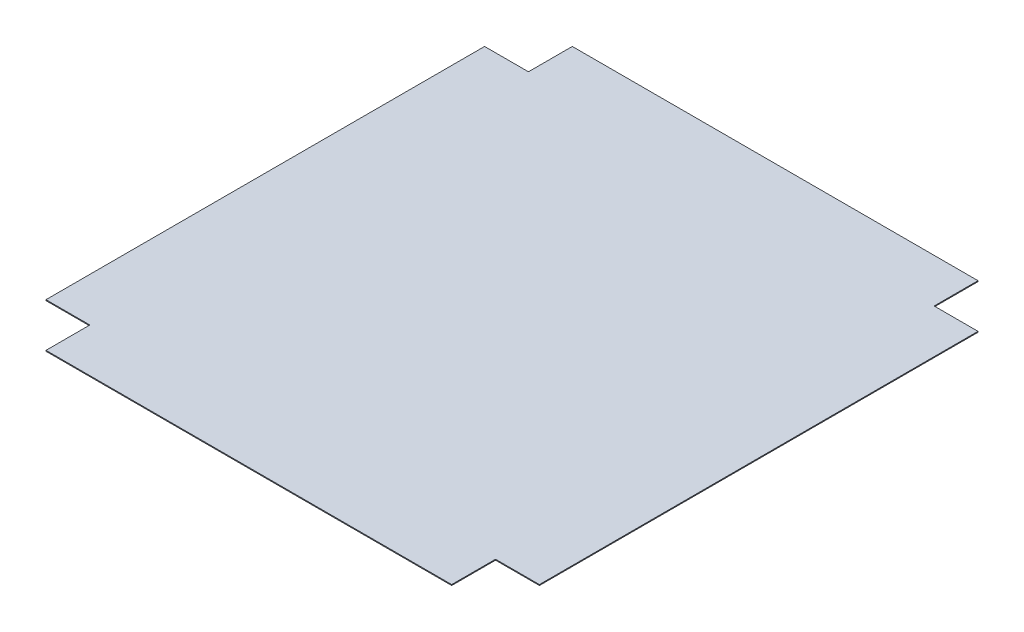
ISO-10303-21;
HEADER;
FILE_DESCRIPTION(('STEP AP214'),'2;1');
FILE_NAME('part.step','',(''),(''),'','','');
FILE_SCHEMA(('AUTOMOTIVE_DESIGN { 1 0 10303 214 1 1 1 1 }'));
ENDSEC;
DATA;
#1=APPLICATION_CONTEXT('core data for automotive mechanical design processes');
#2=APPLICATION_PROTOCOL_DEFINITION('international standard','automotive_design',2000,#1);
#3=PRODUCT_CONTEXT('',#1,'mechanical');
#4=PRODUCT('Part','Part','',(#3));
#5=PRODUCT_RELATED_PRODUCT_CATEGORY('part','',(#4));
#6=PRODUCT_DEFINITION_FORMATION('','',#4);
#7=PRODUCT_DEFINITION_CONTEXT('part definition',#1,'design');
#8=PRODUCT_DEFINITION('design','',#6,#7);
#9=PRODUCT_DEFINITION_SHAPE('','',#8);
#10=(LENGTH_UNIT() NAMED_UNIT(*) SI_UNIT(.MILLI.,.METRE.));
#11=(NAMED_UNIT(*) PLANE_ANGLE_UNIT() SI_UNIT($,.RADIAN.));
#12=(NAMED_UNIT(*) SI_UNIT($,.STERADIAN.) SOLID_ANGLE_UNIT());
#13=UNCERTAINTY_MEASURE_WITH_UNIT(LENGTH_MEASURE(1.E-05),#10,'distance_accuracy_value','');
#14=(GEOMETRIC_REPRESENTATION_CONTEXT(3) GLOBAL_UNCERTAINTY_ASSIGNED_CONTEXT((#13)) GLOBAL_UNIT_ASSIGNED_CONTEXT((#10,
#11,#12)) REPRESENTATION_CONTEXT('',''));
#15=CARTESIAN_POINT('',(0.,0.,0.));
#16=DIRECTION('',(0.,0.,1.));
#17=DIRECTION('',(1.,0.,0.));
#18=AXIS2_PLACEMENT_3D('',#15,#16,#17);
#19=CARTESIAN_POINT('',(-92.5,0.4064,-120.));
#20=DIRECTION('',(0.,0.,1.));
#21=DIRECTION('',(1.,0.,0.));
#22=AXIS2_PLACEMENT_3D('',#19,#20,#21);
#23=PLANE('',#22);
#24=DIRECTION('',(-1.,0.,0.));
#25=VECTOR('',#24,1.);
#26=CARTESIAN_POINT('',(-92.5,0.,-120.));
#27=LINE('',#26,#25);
#28=CARTESIAN_POINT('',(92.5,0.,-120.));
#29=VERTEX_POINT('',#28);
#30=CARTESIAN_POINT('',(-92.5,0.,-120.));
#31=VERTEX_POINT('',#30);
#32=EDGE_CURVE('E159',#29,#31,#27,.T.);
#33=ORIENTED_EDGE('',*,*,#32,.T.);
#34=DIRECTION('',(0.,-1.,0.));
#35=VECTOR('',#34,1.);
#36=CARTESIAN_POINT('',(-92.5,0.4064,-120.));
#37=LINE('',#36,#35);
#38=CARTESIAN_POINT('',(-92.5,0.4064,-120.));
#39=VERTEX_POINT('',#38);
#40=EDGE_CURVE('E11',#39,#31,#37,.T.);
#41=ORIENTED_EDGE('',*,*,#40,.F.);
#42=DIRECTION('',(-1.,0.,0.));
#43=VECTOR('',#42,1.);
#44=CARTESIAN_POINT('',(-92.5,0.4064,-120.));
#45=LINE('',#44,#43);
#46=CARTESIAN_POINT('',(92.5,0.4064,-120.));
#47=VERTEX_POINT('',#46);
#48=EDGE_CURVE('E181',#47,#39,#45,.T.);
#49=ORIENTED_EDGE('',*,*,#48,.F.);
#50=DIRECTION('',(0.,-1.,0.));
#51=VECTOR('',#50,1.);
#52=CARTESIAN_POINT('',(92.5,0.4064,-120.));
#53=LINE('',#52,#51);
#54=EDGE_CURVE('E155',#47,#29,#53,.T.);
#55=ORIENTED_EDGE('',*,*,#54,.T.);
#56=EDGE_LOOP('',(#33,#41,#49,#55));
#57=FACE_BOUND('',#56,.T.);
#58=ADVANCED_FACE('F39',(#57),#23,.F.);
#59=CARTESIAN_POINT('',(-92.5,0.4064,-120.));
#60=DIRECTION('',(1.,0.,0.));
#61=DIRECTION('',(0.,0.,-1.));
#62=AXIS2_PLACEMENT_3D('',#59,#60,#61);
#63=PLANE('',#62);
#64=DIRECTION('',(0.,0.,1.));
#65=VECTOR('',#64,1.);
#66=CARTESIAN_POINT('',(-92.5,0.,-120.));
#67=LINE('',#66,#65);
#68=CARTESIAN_POINT('',(-92.5,0.,-100.000000122));
#69=VERTEX_POINT('',#68);
#70=EDGE_CURVE('E162',#31,#69,#67,.T.);
#71=ORIENTED_EDGE('',*,*,#70,.T.);
#72=DIRECTION('',(0.,-1.,0.));
#73=VECTOR('',#72,1.);
#74=CARTESIAN_POINT('',(-92.5,0.4064,-100.000000122));
#75=LINE('',#74,#73);
#76=CARTESIAN_POINT('',(-92.5,0.4064,-100.000000122));
#77=VERTEX_POINT('',#76);
#78=EDGE_CURVE('E47',#77,#69,#75,.T.);
#79=ORIENTED_EDGE('',*,*,#78,.F.);
#80=DIRECTION('',(0.,0.,1.));
#81=VECTOR('',#80,1.);
#82=CARTESIAN_POINT('',(-92.5,0.4064,-120.));
#83=LINE('',#82,#81);
#84=EDGE_CURVE('E110',#39,#77,#83,.T.);
#85=ORIENTED_EDGE('',*,*,#84,.F.);
#86=ORIENTED_EDGE('',*,*,#40,.T.);
#87=EDGE_LOOP('',(#71,#79,#85,#86));
#88=FACE_BOUND('',#87,.T.);
#89=ADVANCED_FACE('F259',(#88),#63,.F.);
#90=CARTESIAN_POINT('',(-92.5,0.4064,-100.000000122));
#91=DIRECTION('',(0.,0.,1.));
#92=DIRECTION('',(1.,0.,0.));
#93=AXIS2_PLACEMENT_3D('',#90,#91,#92);
#94=PLANE('',#93);
#95=DIRECTION('',(-1.,0.,0.));
#96=VECTOR('',#95,1.);
#97=CARTESIAN_POINT('',(-92.5,0.,-100.000000122));
#98=LINE('',#97,#96);
#99=CARTESIAN_POINT('',(-112.5,0.,-100.000000122));
#100=VERTEX_POINT('',#99);
#101=EDGE_CURVE('E164',#69,#100,#98,.T.);
#102=ORIENTED_EDGE('',*,*,#101,.T.);
#103=DIRECTION('',(0.,-1.,0.));
#104=VECTOR('',#103,1.);
#105=CARTESIAN_POINT('',(-112.5,0.4064,-100.000000122));
#106=LINE('',#105,#104);
#107=CARTESIAN_POINT('',(-112.5,0.4064,-100.000000122));
#108=VERTEX_POINT('',#107);
#109=EDGE_CURVE('E200',#108,#100,#106,.T.);
#110=ORIENTED_EDGE('',*,*,#109,.F.);
#111=DIRECTION('',(-1.,0.,0.));
#112=VECTOR('',#111,1.);
#113=CARTESIAN_POINT('',(-92.5,0.4064,-100.000000122));
#114=LINE('',#113,#112);
#115=EDGE_CURVE('E208',#77,#108,#114,.T.);
#116=ORIENTED_EDGE('',*,*,#115,.F.);
#117=ORIENTED_EDGE('',*,*,#78,.T.);
#118=EDGE_LOOP('',(#102,#110,#116,#117));
#119=FACE_BOUND('',#118,.T.);
#120=ADVANCED_FACE('F206',(#119),#94,.F.);
#121=CARTESIAN_POINT('',(-112.5,0.4064,100.000000122));
#122=DIRECTION('',(1.,0.,0.));
#123=DIRECTION('',(0.,0.,-1.));
#124=AXIS2_PLACEMENT_3D('',#121,#122,#123);
#125=PLANE('',#124);
#126=DIRECTION('',(0.,0.,1.));
#127=VECTOR('',#126,1.);
#128=CARTESIAN_POINT('',(-112.5,0.,100.000000122));
#129=LINE('',#128,#127);
#130=CARTESIAN_POINT('',(-112.5,0.,100.000000122));
#131=VERTEX_POINT('',#130);
#132=EDGE_CURVE('E166',#100,#131,#129,.T.);
#133=ORIENTED_EDGE('',*,*,#132,.T.);
#134=DIRECTION('',(0.,-1.,0.));
#135=VECTOR('',#134,1.);
#136=CARTESIAN_POINT('',(-112.5,0.4064,100.000000122));
#137=LINE('',#136,#135);
#138=CARTESIAN_POINT('',(-112.5,0.4064,100.000000122));
#139=VERTEX_POINT('',#138);
#140=EDGE_CURVE('E197',#139,#131,#137,.T.);
#141=ORIENTED_EDGE('',*,*,#140,.F.);
#142=DIRECTION('',(0.,0.,1.));
#143=VECTOR('',#142,1.);
#144=CARTESIAN_POINT('',(-112.5,0.4064,100.000000122));
#145=LINE('',#144,#143);
#146=EDGE_CURVE('E226',#108,#139,#145,.T.);
#147=ORIENTED_EDGE('',*,*,#146,.F.);
#148=ORIENTED_EDGE('',*,*,#109,.T.);
#149=EDGE_LOOP('',(#133,#141,#147,#148));
#150=FACE_BOUND('',#149,.T.);
#151=ADVANCED_FACE('F217',(#150),#125,.F.);
#152=CARTESIAN_POINT('',(-92.5,0.4064,100.000000122));
#153=DIRECTION('',(0.,0.,-1.));
#154=DIRECTION('',(-1.,0.,0.));
#155=AXIS2_PLACEMENT_3D('',#152,#153,#154);
#156=PLANE('',#155);
#157=DIRECTION('',(1.,0.,0.));
#158=VECTOR('',#157,1.);
#159=CARTESIAN_POINT('',(-92.5,0.,100.000000122));
#160=LINE('',#159,#158);
#161=CARTESIAN_POINT('',(-92.5,0.,100.000000122));
#162=VERTEX_POINT('',#161);
#163=EDGE_CURVE('E168',#131,#162,#160,.T.);
#164=ORIENTED_EDGE('',*,*,#163,.T.);
#165=DIRECTION('',(0.,-1.,0.));
#166=VECTOR('',#165,1.);
#167=CARTESIAN_POINT('',(-92.5,0.4064,100.000000122));
#168=LINE('',#167,#166);
#169=CARTESIAN_POINT('',(-92.5,0.4064,100.000000122));
#170=VERTEX_POINT('',#169);
#171=EDGE_CURVE('E194',#170,#162,#168,.T.);
#172=ORIENTED_EDGE('',*,*,#171,.F.);
#173=DIRECTION('',(1.,0.,0.));
#174=VECTOR('',#173,1.);
#175=CARTESIAN_POINT('',(-92.5,0.4064,100.000000122));
#176=LINE('',#175,#174);
#177=EDGE_CURVE('E223',#139,#170,#176,.T.);
#178=ORIENTED_EDGE('',*,*,#177,.F.);
#179=ORIENTED_EDGE('',*,*,#140,.T.);
#180=EDGE_LOOP('',(#164,#172,#178,#179));
#181=FACE_BOUND('',#180,.T.);
#182=ADVANCED_FACE('F221',(#181),#156,.F.);
#183=CARTESIAN_POINT('',(-92.5,0.4064,120.));
#184=DIRECTION('',(1.,0.,0.));
#185=DIRECTION('',(0.,0.,-1.));
#186=AXIS2_PLACEMENT_3D('',#183,#184,#185);
#187=PLANE('',#186);
#188=DIRECTION('',(0.,0.,1.));
#189=VECTOR('',#188,1.);
#190=CARTESIAN_POINT('',(-92.5,0.,120.));
#191=LINE('',#190,#189);
#192=CARTESIAN_POINT('',(-92.5,0.,120.));
#193=VERTEX_POINT('',#192);
#194=EDGE_CURVE('E170',#162,#193,#191,.T.);
#195=ORIENTED_EDGE('',*,*,#194,.T.);
#196=DIRECTION('',(0.,-1.,0.));
#197=VECTOR('',#196,1.);
#198=CARTESIAN_POINT('',(-92.5,0.4064,120.));
#199=LINE('',#198,#197);
#200=CARTESIAN_POINT('',(-92.5,0.4064,120.));
#201=VERTEX_POINT('',#200);
#202=EDGE_CURVE('E191',#201,#193,#199,.T.);
#203=ORIENTED_EDGE('',*,*,#202,.F.);
#204=DIRECTION('',(0.,0.,1.));
#205=VECTOR('',#204,1.);
#206=CARTESIAN_POINT('',(-92.5,0.4064,120.));
#207=LINE('',#206,#205);
#208=EDGE_CURVE('E225',#170,#201,#207,.T.);
#209=ORIENTED_EDGE('',*,*,#208,.F.);
#210=ORIENTED_EDGE('',*,*,#171,.T.);
#211=EDGE_LOOP('',(#195,#203,#209,#210));
#212=FACE_BOUND('',#211,.T.);
#213=ADVANCED_FACE('F272',(#212),#187,.F.);
#214=CARTESIAN_POINT('',(92.5,0.4064,120.));
#215=DIRECTION('',(0.,0.,-1.));
#216=DIRECTION('',(-1.,0.,0.));
#217=AXIS2_PLACEMENT_3D('',#214,#215,#216);
#218=PLANE('',#217);
#219=DIRECTION('',(1.,0.,0.));
#220=VECTOR('',#219,1.);
#221=CARTESIAN_POINT('',(92.5,0.,120.));
#222=LINE('',#221,#220);
#223=CARTESIAN_POINT('',(92.5,0.,120.));
#224=VERTEX_POINT('',#223);
#225=EDGE_CURVE('E172',#193,#224,#222,.T.);
#226=ORIENTED_EDGE('',*,*,#225,.T.);
#227=DIRECTION('',(0.,-1.,0.));
#228=VECTOR('',#227,1.);
#229=CARTESIAN_POINT('',(92.5,0.4064,120.));
#230=LINE('',#229,#228);
#231=CARTESIAN_POINT('',(92.5,0.4064,120.));
#232=VERTEX_POINT('',#231);
#233=EDGE_CURVE('E188',#232,#224,#230,.T.);
#234=ORIENTED_EDGE('',*,*,#233,.F.);
#235=DIRECTION('',(1.,0.,0.));
#236=VECTOR('',#235,1.);
#237=CARTESIAN_POINT('',(92.5,0.4064,120.));
#238=LINE('',#237,#236);
#239=EDGE_CURVE('E228',#201,#232,#238,.T.);
#240=ORIENTED_EDGE('',*,*,#239,.F.);
#241=ORIENTED_EDGE('',*,*,#202,.T.);
#242=EDGE_LOOP('',(#226,#234,#240,#241));
#243=FACE_BOUND('',#242,.T.);
#244=ADVANCED_FACE('F275',(#243),#218,.F.);
#245=CARTESIAN_POINT('',(92.5,0.4064,100.000000122));
#246=DIRECTION('',(-1.,0.,0.));
#247=DIRECTION('',(0.,0.,1.));
#248=AXIS2_PLACEMENT_3D('',#245,#246,#247);
#249=PLANE('',#248);
#250=DIRECTION('',(0.,0.,-1.));
#251=VECTOR('',#250,1.);
#252=CARTESIAN_POINT('',(92.5,0.,100.000000122));
#253=LINE('',#252,#251);
#254=CARTESIAN_POINT('',(92.5,0.,100.000000122));
#255=VERTEX_POINT('',#254);
#256=EDGE_CURVE('E174',#224,#255,#253,.T.);
#257=ORIENTED_EDGE('',*,*,#256,.T.);
#258=DIRECTION('',(0.,-1.,0.));
#259=VECTOR('',#258,1.);
#260=CARTESIAN_POINT('',(92.5,0.4064,100.000000122));
#261=LINE('',#260,#259);
#262=CARTESIAN_POINT('',(92.5,0.4064,100.000000122));
#263=VERTEX_POINT('',#262);
#264=EDGE_CURVE('E185',#263,#255,#261,.T.);
#265=ORIENTED_EDGE('',*,*,#264,.F.);
#266=DIRECTION('',(0.,0.,-1.));
#267=VECTOR('',#266,1.);
#268=CARTESIAN_POINT('',(92.5,0.4064,100.000000122));
#269=LINE('',#268,#267);
#270=EDGE_CURVE('E234',#232,#263,#269,.T.);
#271=ORIENTED_EDGE('',*,*,#270,.F.);
#272=ORIENTED_EDGE('',*,*,#233,.T.);
#273=EDGE_LOOP('',(#257,#265,#271,#272));
#274=FACE_BOUND('',#273,.T.);
#275=ADVANCED_FACE('F240',(#274),#249,.F.);
#276=CARTESIAN_POINT('',(112.5,0.4064,100.000000122));
#277=DIRECTION('',(0.,0.,-1.));
#278=DIRECTION('',(-1.,0.,0.));
#279=AXIS2_PLACEMENT_3D('',#276,#277,#278);
#280=PLANE('',#279);
#281=DIRECTION('',(1.,0.,0.));
#282=VECTOR('',#281,1.);
#283=CARTESIAN_POINT('',(112.5,0.,100.000000122));
#284=LINE('',#283,#282);
#285=CARTESIAN_POINT('',(112.5,0.,100.000000122));
#286=VERTEX_POINT('',#285);
#287=EDGE_CURVE('E176',#255,#286,#284,.T.);
#288=ORIENTED_EDGE('',*,*,#287,.T.);
#289=DIRECTION('',(0.,-1.,0.));
#290=VECTOR('',#289,1.);
#291=CARTESIAN_POINT('',(112.5,0.4064,100.000000122));
#292=LINE('',#291,#290);
#293=CARTESIAN_POINT('',(112.5,0.4064,100.000000122));
#294=VERTEX_POINT('',#293);
#295=EDGE_CURVE('E150',#294,#286,#292,.T.);
#296=ORIENTED_EDGE('',*,*,#295,.F.);
#297=DIRECTION('',(1.,0.,0.));
#298=VECTOR('',#297,1.);
#299=CARTESIAN_POINT('',(112.5,0.4064,100.000000122));
#300=LINE('',#299,#298);
#301=EDGE_CURVE('E141',#263,#294,#300,.T.);
#302=ORIENTED_EDGE('',*,*,#301,.F.);
#303=ORIENTED_EDGE('',*,*,#264,.T.);
#304=EDGE_LOOP('',(#288,#296,#302,#303));
#305=FACE_BOUND('',#304,.T.);
#306=ADVANCED_FACE('F244',(#305),#280,.F.);
#307=CARTESIAN_POINT('',(112.5,0.4064,-100.000000122));
#308=DIRECTION('',(-1.,0.,0.));
#309=DIRECTION('',(0.,0.,1.));
#310=AXIS2_PLACEMENT_3D('',#307,#308,#309);
#311=PLANE('',#310);
#312=DIRECTION('',(0.,0.,-1.));
#313=VECTOR('',#312,1.);
#314=CARTESIAN_POINT('',(112.5,0.,-100.000000122));
#315=LINE('',#314,#313);
#316=CARTESIAN_POINT('',(112.5,0.,-100.000000122));
#317=VERTEX_POINT('',#316);
#318=EDGE_CURVE('E149',#286,#317,#315,.T.);
#319=ORIENTED_EDGE('',*,*,#318,.T.);
#320=DIRECTION('',(0.,-1.,0.));
#321=VECTOR('',#320,1.);
#322=CARTESIAN_POINT('',(112.5,0.4064,-100.000000122));
#323=LINE('',#322,#321);
#324=CARTESIAN_POINT('',(112.5,0.4064,-100.000000122));
#325=VERTEX_POINT('',#324);
#326=EDGE_CURVE('E146',#325,#317,#323,.T.);
#327=ORIENTED_EDGE('',*,*,#326,.F.);
#328=DIRECTION('',(0.,0.,-1.));
#329=VECTOR('',#328,1.);
#330=CARTESIAN_POINT('',(112.5,0.4064,-100.000000122));
#331=LINE('',#330,#329);
#332=EDGE_CURVE('E135',#294,#325,#331,.T.);
#333=ORIENTED_EDGE('',*,*,#332,.F.);
#334=ORIENTED_EDGE('',*,*,#295,.T.);
#335=EDGE_LOOP('',(#319,#327,#333,#334));
#336=FACE_BOUND('',#335,.T.);
#337=ADVANCED_FACE('F147',(#336),#311,.F.);
#338=CARTESIAN_POINT('',(92.5,0.4064,-100.000000122));
#339=DIRECTION('',(0.,0.,1.));
#340=DIRECTION('',(1.,0.,0.));
#341=AXIS2_PLACEMENT_3D('',#338,#339,#340);
#342=PLANE('',#341);
#343=DIRECTION('',(-1.,0.,0.));
#344=VECTOR('',#343,1.);
#345=CARTESIAN_POINT('',(92.5,0.,-100.000000122));
#346=LINE('',#345,#344);
#347=CARTESIAN_POINT('',(92.5,0.,-100.000000122));
#348=VERTEX_POINT('',#347);
#349=EDGE_CURVE('E96',#317,#348,#346,.T.);
#350=ORIENTED_EDGE('',*,*,#349,.T.);
#351=DIRECTION('',(0.,-1.,0.));
#352=VECTOR('',#351,1.);
#353=CARTESIAN_POINT('',(92.5,0.4064,-100.000000122));
#354=LINE('',#353,#352);
#355=CARTESIAN_POINT('',(92.5,0.4064,-100.000000122));
#356=VERTEX_POINT('',#355);
#357=EDGE_CURVE('E151',#356,#348,#354,.T.);
#358=ORIENTED_EDGE('',*,*,#357,.F.);
#359=DIRECTION('',(-1.,0.,0.));
#360=VECTOR('',#359,1.);
#361=CARTESIAN_POINT('',(92.5,0.4064,-100.000000122));
#362=LINE('',#361,#360);
#363=EDGE_CURVE('E139',#325,#356,#362,.T.);
#364=ORIENTED_EDGE('',*,*,#363,.F.);
#365=ORIENTED_EDGE('',*,*,#326,.T.);
#366=EDGE_LOOP('',(#350,#358,#364,#365));
#367=FACE_BOUND('',#366,.T.);
#368=ADVANCED_FACE('F153',(#367),#342,.F.);
#369=CARTESIAN_POINT('',(92.5,0.4064,-120.));
#370=DIRECTION('',(-1.,0.,0.));
#371=DIRECTION('',(0.,0.,1.));
#372=AXIS2_PLACEMENT_3D('',#369,#370,#371);
#373=PLANE('',#372);
#374=DIRECTION('',(0.,0.,-1.));
#375=VECTOR('',#374,1.);
#376=CARTESIAN_POINT('',(92.5,0.,-120.));
#377=LINE('',#376,#375);
#378=EDGE_CURVE('E102',#348,#29,#377,.T.);
#379=ORIENTED_EDGE('',*,*,#378,.T.);
#380=ORIENTED_EDGE('',*,*,#54,.F.);
#381=DIRECTION('',(0.,0.,-1.));
#382=VECTOR('',#381,1.);
#383=CARTESIAN_POINT('',(92.5,0.4064,-120.));
#384=LINE('',#383,#382);
#385=EDGE_CURVE('E55',#356,#47,#384,.T.);
#386=ORIENTED_EDGE('',*,*,#385,.F.);
#387=ORIENTED_EDGE('',*,*,#357,.T.);
#388=EDGE_LOOP('',(#379,#380,#386,#387));
#389=FACE_BOUND('',#388,.T.);
#390=ADVANCED_FACE('F248',(#389),#373,.F.);
#391=CARTESIAN_POINT('',(0.,0.4064,0.));
#392=DIRECTION('',(0.,-1.,0.));
#393=DIRECTION('',(0.,0.,-1.));
#394=AXIS2_PLACEMENT_3D('',#391,#392,#393);
#395=PLANE('',#394);
#396=ORIENTED_EDGE('',*,*,#48,.T.);
#397=ORIENTED_EDGE('',*,*,#84,.T.);
#398=ORIENTED_EDGE('',*,*,#115,.T.);
#399=ORIENTED_EDGE('',*,*,#146,.T.);
#400=ORIENTED_EDGE('',*,*,#177,.T.);
#401=ORIENTED_EDGE('',*,*,#208,.T.);
#402=ORIENTED_EDGE('',*,*,#239,.T.);
#403=ORIENTED_EDGE('',*,*,#270,.T.);
#404=ORIENTED_EDGE('',*,*,#301,.T.);
#405=ORIENTED_EDGE('',*,*,#332,.T.);
#406=ORIENTED_EDGE('',*,*,#363,.T.);
#407=ORIENTED_EDGE('',*,*,#385,.T.);
#408=EDGE_LOOP('',(#396,#397,#398,#399,#400,#401,#402,#403,#404,#405,#406,#407));
#409=FACE_BOUND('',#408,.T.);
#410=ADVANCED_FACE('F137',(#409),#395,.F.);
#411=CARTESIAN_POINT('',(0.,0.,0.));
#412=DIRECTION('',(0.,-1.,0.));
#413=DIRECTION('',(0.,0.,-1.));
#414=AXIS2_PLACEMENT_3D('',#411,#412,#413);
#415=PLANE('',#414);
#416=ORIENTED_EDGE('',*,*,#32,.F.);
#417=ORIENTED_EDGE('',*,*,#378,.F.);
#418=ORIENTED_EDGE('',*,*,#349,.F.);
#419=ORIENTED_EDGE('',*,*,#318,.F.);
#420=ORIENTED_EDGE('',*,*,#287,.F.);
#421=ORIENTED_EDGE('',*,*,#256,.F.);
#422=ORIENTED_EDGE('',*,*,#225,.F.);
#423=ORIENTED_EDGE('',*,*,#194,.F.);
#424=ORIENTED_EDGE('',*,*,#163,.F.);
#425=ORIENTED_EDGE('',*,*,#132,.F.);
#426=ORIENTED_EDGE('',*,*,#101,.F.);
#427=ORIENTED_EDGE('',*,*,#70,.F.);
#428=EDGE_LOOP('',(#416,#417,#418,#419,#420,#421,#422,#423,#424,#425,#426,#427));
#429=FACE_BOUND('',#428,.T.);
#430=ADVANCED_FACE('F212',(#429),#415,.T.);
#431=CLOSED_SHELL('',(#58,#89,#120,#151,#182,#213,#244,#275,#306,#337,#368,#390,#410,#430));
#432=MANIFOLD_SOLID_BREP('B2',#431);
#433=ADVANCED_BREP_SHAPE_REPRESENTATION('',(#18,#432),#14);
#434=SHAPE_DEFINITION_REPRESENTATION(#9,#433);
ENDSEC;
END-ISO-10303-21;
